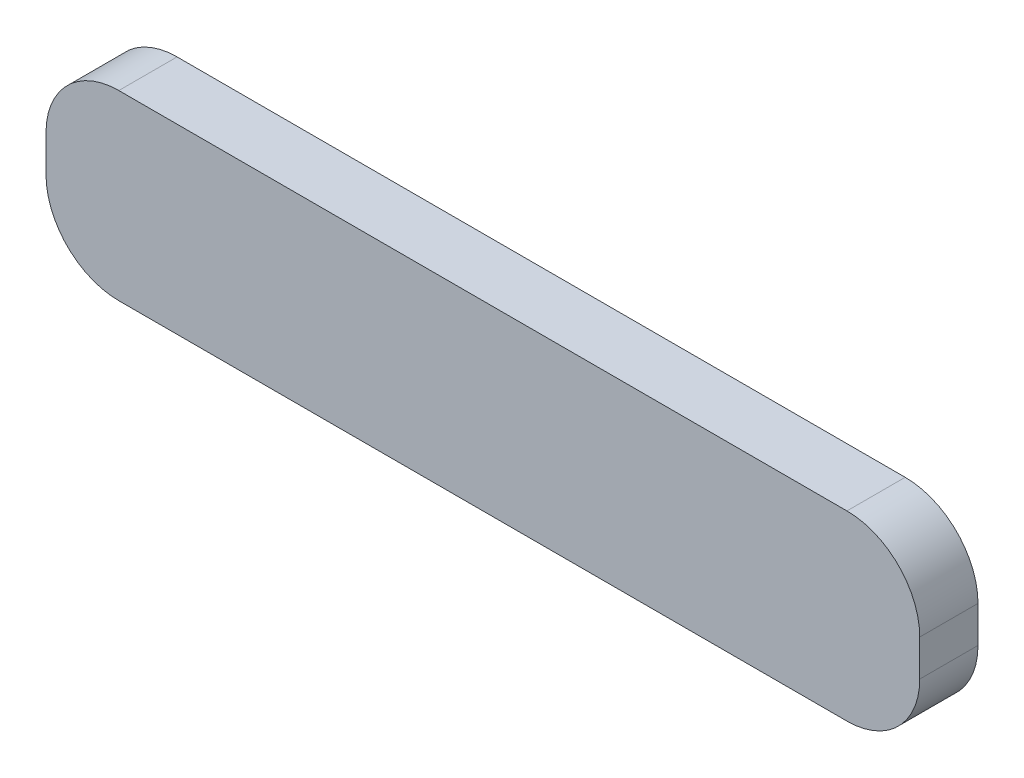
ISO-10303-21;
HEADER;
FILE_DESCRIPTION(('STEP AP214'),'2;1');
FILE_NAME('part.step','',(''),(''),'','','');
FILE_SCHEMA(('AUTOMOTIVE_DESIGN { 1 0 10303 214 1 1 1 1 }'));
ENDSEC;
DATA;
#1=APPLICATION_CONTEXT('core data for automotive mechanical design processes');
#2=APPLICATION_PROTOCOL_DEFINITION('international standard','automotive_design',2000,#1);
#3=PRODUCT_CONTEXT('',#1,'mechanical');
#4=PRODUCT('Part','Part','',(#3));
#5=PRODUCT_RELATED_PRODUCT_CATEGORY('part','',(#4));
#6=PRODUCT_DEFINITION_FORMATION('','',#4);
#7=PRODUCT_DEFINITION_CONTEXT('part definition',#1,'design');
#8=PRODUCT_DEFINITION('design','',#6,#7);
#9=PRODUCT_DEFINITION_SHAPE('','',#8);
#10=(LENGTH_UNIT() NAMED_UNIT(*) SI_UNIT(.MILLI.,.METRE.));
#11=(NAMED_UNIT(*) PLANE_ANGLE_UNIT() SI_UNIT($,.RADIAN.));
#12=(NAMED_UNIT(*) SI_UNIT($,.STERADIAN.) SOLID_ANGLE_UNIT());
#13=UNCERTAINTY_MEASURE_WITH_UNIT(LENGTH_MEASURE(1.E-05),#10,'distance_accuracy_value','');
#14=(GEOMETRIC_REPRESENTATION_CONTEXT(3) GLOBAL_UNCERTAINTY_ASSIGNED_CONTEXT((#13)) GLOBAL_UNIT_ASSIGNED_CONTEXT((#10,
#11,#12)) REPRESENTATION_CONTEXT('',''));
#15=CARTESIAN_POINT('',(0.,0.,0.));
#16=DIRECTION('',(0.,0.,1.));
#17=DIRECTION('',(1.,0.,0.));
#18=AXIS2_PLACEMENT_3D('',#15,#16,#17);
#19=CARTESIAN_POINT('',(-59.5391705069124,-8.13364055299539,8.));
#20=DIRECTION('',(1.,0.,0.));
#21=DIRECTION('',(0.,0.,-1.));
#22=AXIS2_PLACEMENT_3D('',#19,#20,#21);
#23=PLANE('',#22);
#24=DIRECTION('',(0.,-1.,0.));
#25=VECTOR('',#24,1.);
#26=CARTESIAN_POINT('',(-59.5391705069124,-8.13364055299539,0.));
#27=LINE('',#26,#25);
#28=CARTESIAN_POINT('',(-59.5391705069124,6.86635944700461,0.));
#29=VERTEX_POINT('',#28);
#30=CARTESIAN_POINT('',(-59.5391705069124,1.86635944700461,0.));
#31=VERTEX_POINT('',#30);
#32=EDGE_CURVE('E130',#29,#31,#27,.T.);
#33=ORIENTED_EDGE('',*,*,#32,.T.);
#34=DIRECTION('',(0.,0.,-1.));
#35=VECTOR('',#34,1.);
#36=CARTESIAN_POINT('',(-59.5391705069124,1.86635944700461,8.));
#37=LINE('',#36,#35);
#38=CARTESIAN_POINT('',(-59.5391705069124,1.86635944700461,8.));
#39=VERTEX_POINT('',#38);
#40=EDGE_CURVE('E11',#31,#39,#37,.F.);
#41=ORIENTED_EDGE('',*,*,#40,.T.);
#42=DIRECTION('',(0.,-1.,0.));
#43=VECTOR('',#42,1.);
#44=CARTESIAN_POINT('',(-59.5391705069124,-8.13364055299539,8.));
#45=LINE('',#44,#43);
#46=CARTESIAN_POINT('',(-59.5391705069124,6.86635944700461,8.));
#47=VERTEX_POINT('',#46);
#48=EDGE_CURVE('E128',#47,#39,#45,.T.);
#49=ORIENTED_EDGE('',*,*,#48,.F.);
#50=DIRECTION('',(0.,0.,-1.));
#51=VECTOR('',#50,1.);
#52=CARTESIAN_POINT('',(-59.5391705069124,6.86635944700461,8.));
#53=LINE('',#52,#51);
#54=EDGE_CURVE('E42',#47,#29,#53,.T.);
#55=ORIENTED_EDGE('',*,*,#54,.T.);
#56=EDGE_LOOP('',(#33,#41,#49,#55));
#57=FACE_BOUND('',#56,.T.);
#58=ADVANCED_FACE('F34',(#57),#23,.F.);
#59=CARTESIAN_POINT('',(-59.5391705069124,-8.13364055299539,8.));
#60=DIRECTION('',(0.,1.,0.));
#61=DIRECTION('',(0.,0.,1.));
#62=AXIS2_PLACEMENT_3D('',#59,#60,#61);
#63=PLANE('',#62);
#64=DIRECTION('',(1.,0.,0.));
#65=VECTOR('',#64,1.);
#66=CARTESIAN_POINT('',(-59.5391705069124,-8.13364055299539,0.));
#67=LINE('',#66,#65);
#68=CARTESIAN_POINT('',(-49.5391705069124,-8.13364055299539,0.));
#69=VERTEX_POINT('',#68);
#70=CARTESIAN_POINT('',(50.4608294930875,-8.13364055299539,0.));
#71=VERTEX_POINT('',#70);
#72=EDGE_CURVE('E126',#69,#71,#67,.T.);
#73=ORIENTED_EDGE('',*,*,#72,.T.);
#74=DIRECTION('',(0.,0.,-1.));
#75=VECTOR('',#74,1.);
#76=CARTESIAN_POINT('',(50.4608294930875,-8.13364055299539,8.));
#77=LINE('',#76,#75);
#78=CARTESIAN_POINT('',(50.4608294930875,-8.13364055299539,8.));
#79=VERTEX_POINT('',#78);
#80=EDGE_CURVE('E105',#71,#79,#77,.F.);
#81=ORIENTED_EDGE('',*,*,#80,.T.);
#82=DIRECTION('',(1.,0.,0.));
#83=VECTOR('',#82,1.);
#84=CARTESIAN_POINT('',(-59.5391705069124,-8.13364055299539,8.));
#85=LINE('',#84,#83);
#86=CARTESIAN_POINT('',(-49.5391705069124,-8.13364055299539,8.));
#87=VERTEX_POINT('',#86);
#88=EDGE_CURVE('E166',#87,#79,#85,.T.);
#89=ORIENTED_EDGE('',*,*,#88,.F.);
#90=DIRECTION('',(0.,0.,-1.));
#91=VECTOR('',#90,1.);
#92=CARTESIAN_POINT('',(-49.5391705069124,-8.13364055299539,8.));
#93=LINE('',#92,#91);
#94=EDGE_CURVE('E110',#87,#69,#93,.T.);
#95=ORIENTED_EDGE('',*,*,#94,.T.);
#96=EDGE_LOOP('',(#73,#81,#89,#95));
#97=FACE_BOUND('',#96,.T.);
#98=ADVANCED_FACE('F176',(#97),#63,.F.);
#99=CARTESIAN_POINT('',(60.4608294930875,-8.13364055299539,8.));
#100=DIRECTION('',(-1.,0.,0.));
#101=DIRECTION('',(0.,-1.,0.));
#102=AXIS2_PLACEMENT_3D('',#99,#100,#101);
#103=PLANE('',#102);
#104=DIRECTION('',(0.,1.,0.));
#105=VECTOR('',#104,1.);
#106=CARTESIAN_POINT('',(60.4608294930875,-8.13364055299539,8.));
#107=LINE('',#106,#105);
#108=CARTESIAN_POINT('',(60.4608294930875,1.8663594470046,8.));
#109=VERTEX_POINT('',#108);
#110=CARTESIAN_POINT('',(60.4608294930875,6.86635944700461,8.));
#111=VERTEX_POINT('',#110);
#112=EDGE_CURVE('E119',#109,#111,#107,.T.);
#113=ORIENTED_EDGE('',*,*,#112,.F.);
#114=DIRECTION('',(0.,0.,-1.));
#115=VECTOR('',#114,1.);
#116=CARTESIAN_POINT('',(60.4608294930875,1.8663594470046,8.));
#117=LINE('',#116,#115);
#118=CARTESIAN_POINT('',(60.4608294930875,1.8663594470046,0.));
#119=VERTEX_POINT('',#118);
#120=EDGE_CURVE('E104',#109,#119,#117,.T.);
#121=ORIENTED_EDGE('',*,*,#120,.T.);
#122=DIRECTION('',(0.,1.,0.));
#123=VECTOR('',#122,1.);
#124=CARTESIAN_POINT('',(60.4608294930875,-8.13364055299539,0.));
#125=LINE('',#124,#123);
#126=CARTESIAN_POINT('',(60.4608294930875,6.86635944700461,0.));
#127=VERTEX_POINT('',#126);
#128=EDGE_CURVE('E117',#119,#127,#125,.T.);
#129=ORIENTED_EDGE('',*,*,#128,.T.);
#130=DIRECTION('',(0.,0.,-1.));
#131=VECTOR('',#130,1.);
#132=CARTESIAN_POINT('',(60.4608294930875,6.86635944700461,8.));
#133=LINE('',#132,#131);
#134=EDGE_CURVE('E121',#127,#111,#133,.F.);
#135=ORIENTED_EDGE('',*,*,#134,.T.);
#136=EDGE_LOOP('',(#113,#121,#129,#135));
#137=FACE_BOUND('',#136,.T.);
#138=ADVANCED_FACE('F116',(#137),#103,.F.);
#139=CARTESIAN_POINT('',(-59.5391705069124,16.8663594470046,8.));
#140=DIRECTION('',(0.,-1.,0.));
#141=DIRECTION('',(0.,0.,-1.));
#142=AXIS2_PLACEMENT_3D('',#139,#140,#141);
#143=PLANE('',#142);
#144=DIRECTION('',(-1.,0.,0.));
#145=VECTOR('',#144,1.);
#146=CARTESIAN_POINT('',(-59.5391705069124,16.8663594470046,8.));
#147=LINE('',#146,#145);
#148=CARTESIAN_POINT('',(50.4608294930875,16.8663594470046,8.));
#149=VERTEX_POINT('',#148);
#150=CARTESIAN_POINT('',(-49.5391705069124,16.8663594470046,8.));
#151=VERTEX_POINT('',#150);
#152=EDGE_CURVE('E134',#149,#151,#147,.T.);
#153=ORIENTED_EDGE('',*,*,#152,.F.);
#154=DIRECTION('',(0.,0.,-1.));
#155=VECTOR('',#154,1.);
#156=CARTESIAN_POINT('',(50.4608294930875,16.8663594470046,8.));
#157=LINE('',#156,#155);
#158=CARTESIAN_POINT('',(50.4608294930875,16.8663594470046,0.));
#159=VERTEX_POINT('',#158);
#160=EDGE_CURVE('E151',#149,#159,#157,.T.);
#161=ORIENTED_EDGE('',*,*,#160,.T.);
#162=DIRECTION('',(-1.,0.,0.));
#163=VECTOR('',#162,1.);
#164=CARTESIAN_POINT('',(-59.5391705069124,16.8663594470046,0.));
#165=LINE('',#164,#163);
#166=CARTESIAN_POINT('',(-49.5391705069124,16.8663594470046,0.));
#167=VERTEX_POINT('',#166);
#168=EDGE_CURVE('E125',#159,#167,#165,.T.);
#169=ORIENTED_EDGE('',*,*,#168,.T.);
#170=DIRECTION('',(0.,0.,-1.));
#171=VECTOR('',#170,1.);
#172=CARTESIAN_POINT('',(-49.5391705069124,16.8663594470046,8.));
#173=LINE('',#172,#171);
#174=EDGE_CURVE('E49',#167,#151,#173,.F.);
#175=ORIENTED_EDGE('',*,*,#174,.T.);
#176=EDGE_LOOP('',(#153,#161,#169,#175));
#177=FACE_BOUND('',#176,.T.);
#178=ADVANCED_FACE('F180',(#177),#143,.F.);
#179=CARTESIAN_POINT('',(0.,0.,8.));
#180=DIRECTION('',(0.,0.,-1.));
#181=DIRECTION('',(-1.,0.,0.));
#182=AXIS2_PLACEMENT_3D('',#179,#180,#181);
#183=PLANE('',#182);
#184=ORIENTED_EDGE('',*,*,#88,.T.);
#185=CARTESIAN_POINT('',(50.4608294930875,1.86635944700461,8.));
#186=DIRECTION('',(0.,0.,-1.));
#187=DIRECTION('',(-1.,0.,0.));
#188=AXIS2_PLACEMENT_3D('',#185,#186,#187);
#189=CIRCLE('',#188,10.);
#190=EDGE_CURVE('E148',#79,#109,#189,.F.);
#191=ORIENTED_EDGE('',*,*,#190,.T.);
#192=ORIENTED_EDGE('',*,*,#112,.T.);
#193=CARTESIAN_POINT('',(50.4608294930875,6.86635944700461,8.));
#194=DIRECTION('',(0.,0.,-1.));
#195=DIRECTION('',(-1.,0.,0.));
#196=AXIS2_PLACEMENT_3D('',#193,#194,#195);
#197=CIRCLE('',#196,10.);
#198=EDGE_CURVE('E56',#111,#149,#197,.F.);
#199=ORIENTED_EDGE('',*,*,#198,.T.);
#200=ORIENTED_EDGE('',*,*,#152,.T.);
#201=CARTESIAN_POINT('',(-49.5391705069124,6.86635944700461,8.));
#202=DIRECTION('',(0.,0.,-1.));
#203=DIRECTION('',(-1.,0.,0.));
#204=AXIS2_PLACEMENT_3D('',#201,#202,#203);
#205=CIRCLE('',#204,10.);
#206=EDGE_CURVE('E143',#151,#47,#205,.F.);
#207=ORIENTED_EDGE('',*,*,#206,.T.);
#208=ORIENTED_EDGE('',*,*,#48,.T.);
#209=CARTESIAN_POINT('',(-49.5391705069124,1.86635944700461,8.));
#210=DIRECTION('',(0.,0.,-1.));
#211=DIRECTION('',(-1.,0.,0.));
#212=AXIS2_PLACEMENT_3D('',#209,#210,#211);
#213=CIRCLE('',#212,10.);
#214=EDGE_CURVE('E145',#39,#87,#213,.F.);
#215=ORIENTED_EDGE('',*,*,#214,.T.);
#216=EDGE_LOOP('',(#184,#191,#192,#199,#200,#207,#208,#215));
#217=FACE_BOUND('',#216,.T.);
#218=ADVANCED_FACE('F170',(#217),#183,.F.);
#219=CARTESIAN_POINT('',(0.,0.,0.));
#220=DIRECTION('',(0.,0.,-1.));
#221=DIRECTION('',(-1.,0.,0.));
#222=AXIS2_PLACEMENT_3D('',#219,#220,#221);
#223=PLANE('',#222);
#224=ORIENTED_EDGE('',*,*,#128,.F.);
#225=CARTESIAN_POINT('',(50.4608294930875,1.86635944700461,0.));
#226=DIRECTION('',(0.,0.,-1.));
#227=DIRECTION('',(-1.,0.,0.));
#228=AXIS2_PLACEMENT_3D('',#225,#226,#227);
#229=CIRCLE('',#228,10.);
#230=EDGE_CURVE('E100',#119,#71,#229,.T.);
#231=ORIENTED_EDGE('',*,*,#230,.T.);
#232=ORIENTED_EDGE('',*,*,#72,.F.);
#233=CARTESIAN_POINT('',(-49.5391705069124,1.86635944700461,0.));
#234=DIRECTION('',(0.,0.,-1.));
#235=DIRECTION('',(-1.,0.,0.));
#236=AXIS2_PLACEMENT_3D('',#233,#234,#235);
#237=CIRCLE('',#236,10.);
#238=EDGE_CURVE('E137',#69,#31,#237,.T.);
#239=ORIENTED_EDGE('',*,*,#238,.T.);
#240=ORIENTED_EDGE('',*,*,#32,.F.);
#241=CARTESIAN_POINT('',(-49.5391705069124,6.86635944700461,0.));
#242=DIRECTION('',(0.,0.,-1.));
#243=DIRECTION('',(-1.,0.,0.));
#244=AXIS2_PLACEMENT_3D('',#241,#242,#243);
#245=CIRCLE('',#244,10.);
#246=EDGE_CURVE('E120',#29,#167,#245,.T.);
#247=ORIENTED_EDGE('',*,*,#246,.T.);
#248=ORIENTED_EDGE('',*,*,#168,.F.);
#249=CARTESIAN_POINT('',(50.4608294930875,6.86635944700461,0.));
#250=DIRECTION('',(0.,0.,-1.));
#251=DIRECTION('',(-1.,0.,0.));
#252=AXIS2_PLACEMENT_3D('',#249,#250,#251);
#253=CIRCLE('',#252,10.);
#254=EDGE_CURVE('E111',#159,#127,#253,.T.);
#255=ORIENTED_EDGE('',*,*,#254,.T.);
#256=EDGE_LOOP('',(#224,#231,#232,#239,#240,#247,#248,#255));
#257=FACE_BOUND('',#256,.T.);
#258=ADVANCED_FACE('F123',(#257),#223,.T.);
#259=CARTESIAN_POINT('',(50.4608294930875,1.86635944700461,8.));
#260=DIRECTION('',(0.,0.,-1.));
#261=DIRECTION('',(-1.,0.,0.));
#262=AXIS2_PLACEMENT_3D('',#259,#260,#261);
#263=CYLINDRICAL_SURFACE('',#262,10.);
#264=ORIENTED_EDGE('',*,*,#190,.F.);
#265=ORIENTED_EDGE('',*,*,#80,.F.);
#266=ORIENTED_EDGE('',*,*,#230,.F.);
#267=ORIENTED_EDGE('',*,*,#120,.F.);
#268=EDGE_LOOP('',(#264,#265,#266,#267));
#269=FACE_BOUND('',#268,.T.);
#270=ADVANCED_FACE('F103',(#269),#263,.T.);
#271=CARTESIAN_POINT('',(50.4608294930875,6.86635944700461,8.));
#272=DIRECTION('',(0.,0.,-1.));
#273=DIRECTION('',(-1.,0.,0.));
#274=AXIS2_PLACEMENT_3D('',#271,#272,#273);
#275=CYLINDRICAL_SURFACE('',#274,10.);
#276=ORIENTED_EDGE('',*,*,#198,.F.);
#277=ORIENTED_EDGE('',*,*,#134,.F.);
#278=ORIENTED_EDGE('',*,*,#254,.F.);
#279=ORIENTED_EDGE('',*,*,#160,.F.);
#280=EDGE_LOOP('',(#276,#277,#278,#279));
#281=FACE_BOUND('',#280,.T.);
#282=ADVANCED_FACE('F179',(#281),#275,.T.);
#283=CARTESIAN_POINT('',(-49.5391705069124,1.86635944700461,8.));
#284=DIRECTION('',(0.,0.,-1.));
#285=DIRECTION('',(-1.,0.,0.));
#286=AXIS2_PLACEMENT_3D('',#283,#284,#285);
#287=CYLINDRICAL_SURFACE('',#286,10.);
#288=ORIENTED_EDGE('',*,*,#214,.F.);
#289=ORIENTED_EDGE('',*,*,#40,.F.);
#290=ORIENTED_EDGE('',*,*,#238,.F.);
#291=ORIENTED_EDGE('',*,*,#94,.F.);
#292=EDGE_LOOP('',(#288,#289,#290,#291));
#293=FACE_BOUND('',#292,.T.);
#294=ADVANCED_FACE('F174',(#293),#287,.T.);
#295=CARTESIAN_POINT('',(-49.5391705069124,6.86635944700461,8.));
#296=DIRECTION('',(0.,0.,-1.));
#297=DIRECTION('',(-1.,0.,0.));
#298=AXIS2_PLACEMENT_3D('',#295,#296,#297);
#299=CYLINDRICAL_SURFACE('',#298,10.);
#300=ORIENTED_EDGE('',*,*,#206,.F.);
#301=ORIENTED_EDGE('',*,*,#174,.F.);
#302=ORIENTED_EDGE('',*,*,#246,.F.);
#303=ORIENTED_EDGE('',*,*,#54,.F.);
#304=EDGE_LOOP('',(#300,#301,#302,#303));
#305=FACE_BOUND('',#304,.T.);
#306=ADVANCED_FACE('F36',(#305),#299,.T.);
#307=CLOSED_SHELL('',(#58,#98,#138,#178,#218,#258,#270,#282,#294,#306));
#308=MANIFOLD_SOLID_BREP('B2',#307);
#309=ADVANCED_BREP_SHAPE_REPRESENTATION('',(#18,#308),#14);
#310=SHAPE_DEFINITION_REPRESENTATION(#9,#309);
ENDSEC;
END-ISO-10303-21;
